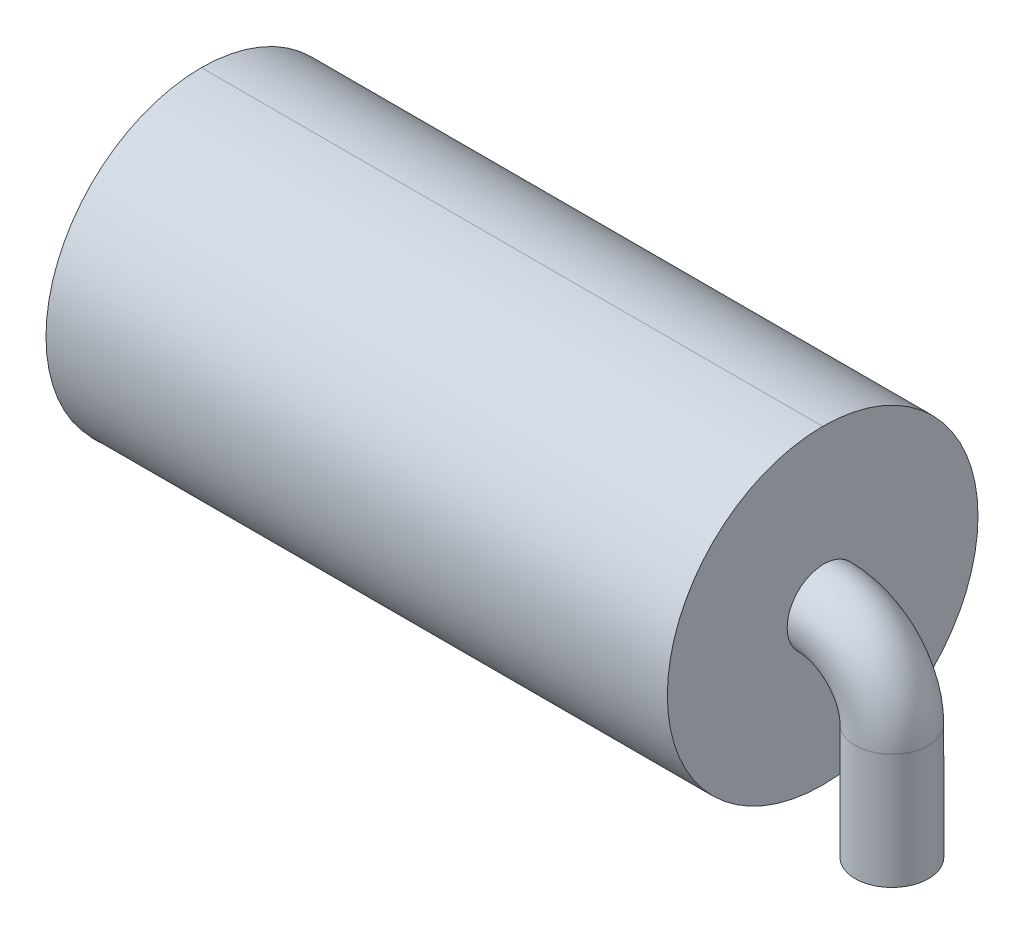
ISO-10303-21;
HEADER;
FILE_DESCRIPTION(('STEP AP214'),'2;1');
FILE_NAME('part.step','',(''),(''),'','','');
FILE_SCHEMA(('AUTOMOTIVE_DESIGN { 1 0 10303 214 1 1 1 1 }'));
ENDSEC;
DATA;
#1=APPLICATION_CONTEXT('core data for automotive mechanical design processes');
#2=APPLICATION_PROTOCOL_DEFINITION('international standard','automotive_design',2000,#1);
#3=PRODUCT_CONTEXT('',#1,'mechanical');
#4=PRODUCT('Part','Part','',(#3));
#5=PRODUCT_RELATED_PRODUCT_CATEGORY('part','',(#4));
#6=PRODUCT_DEFINITION_FORMATION('','',#4);
#7=PRODUCT_DEFINITION_CONTEXT('part definition',#1,'design');
#8=PRODUCT_DEFINITION('design','',#6,#7);
#9=PRODUCT_DEFINITION_SHAPE('','',#8);
#10=(LENGTH_UNIT() NAMED_UNIT(*) SI_UNIT(.MILLI.,.METRE.));
#11=(NAMED_UNIT(*) PLANE_ANGLE_UNIT() SI_UNIT($,.RADIAN.));
#12=(NAMED_UNIT(*) SI_UNIT($,.STERADIAN.) SOLID_ANGLE_UNIT());
#13=UNCERTAINTY_MEASURE_WITH_UNIT(LENGTH_MEASURE(1.E-05),#10,'distance_accuracy_value','');
#14=(GEOMETRIC_REPRESENTATION_CONTEXT(3) GLOBAL_UNCERTAINTY_ASSIGNED_CONTEXT((#13)) GLOBAL_UNIT_ASSIGNED_CONTEXT((#10,
#11,#12)) REPRESENTATION_CONTEXT('',''));
#15=CARTESIAN_POINT('',(0.,0.,0.));
#16=DIRECTION('',(0.,0.,1.));
#17=DIRECTION('',(1.,0.,0.));
#18=AXIS2_PLACEMENT_3D('',#15,#16,#17);
#19=CARTESIAN_POINT('',(2.54,0.,0.));
#20=DIRECTION('',(1.,0.,0.));
#21=DIRECTION('',(0.,1.,0.));
#22=AXIS2_PLACEMENT_3D('',#19,#20,#21);
#23=PLANE('',#22);
#24=CARTESIAN_POINT('',(2.55,0.299999999766548,-1.18351607946541E-05));
#25=CARTESIAN_POINT('',(2.55,0.300000297545742,0.00489690830954471));
#26=CARTESIAN_POINT('',(2.55,0.299879912208961,0.00980564768074171));
#27=CARTESIAN_POINT('',(2.55,0.299398522495433,0.0196113150831491));
#28=CARTESIAN_POINT('',(2.55,0.299037518118686,0.0245082431143594));
#29=CARTESIAN_POINT('',(2.55,0.29807563751721,0.0342784846950915));
#30=CARTESIAN_POINT('',(2.55,0.297474761292481,0.0391517982446132));
#31=CARTESIAN_POINT('',(2.55,0.296034617382054,0.0488630722339955));
#32=CARTESIAN_POINT('',(2.55,0.295195349696356,0.0537010326738559));
#33=CARTESIAN_POINT('',(2.55,0.293280435938311,0.0633299449417355));
#34=CARTESIAN_POINT('',(2.55,0.292204789865964,0.0681208967697547));
#35=CARTESIAN_POINT('',(2.55,0.28981971301685,0.0776442501070406));
#36=CARTESIAN_POINT('',(2.55,0.288510282240083,0.0823766516163074));
#37=CARTESIAN_POINT('',(2.55,0.285660789884107,0.0917715035153467));
#38=CARTESIAN_POINT('',(2.55,0.284120728304898,0.0964339539051193));
#39=CARTESIAN_POINT('',(2.55,0.280813684656474,0.105677671322104));
#40=CARTESIAN_POINT('',(2.55,0.279046702587259,0.110258938349317));
#41=CARTESIAN_POINT('',(2.55,0.275290074728061,0.119329252365416));
#42=CARTESIAN_POINT('',(2.55,0.273300428938078,0.123818299354303));
#43=CARTESIAN_POINT('',(2.55,0.269103266880471,0.132693358786957));
#44=CARTESIAN_POINT('',(2.55,0.266895750612848,0.137079371230725));
#45=CARTESIAN_POINT('',(2.55,0.26226816569675,0.145737795284833));
#46=CARTESIAN_POINT('',(2.55,0.259848097048276,0.150010206895175));
#47=CARTESIAN_POINT('',(2.55,0.254801237528696,0.158431136668687));
#48=CARTESIAN_POINT('',(2.55,0.25217444665759,0.162579654831857));
#49=CARTESIAN_POINT('',(2.55,0.246720470861802,0.170742803567392));
#50=CARTESIAN_POINT('',(2.55,0.243893285937119,0.174757434139757));
#51=CARTESIAN_POINT('',(2.55,0.238045332970355,0.182643136096996));
#52=CARTESIAN_POINT('',(2.55,0.235024564928274,0.18651420748187));
#53=CARTESIAN_POINT('',(2.55,0.228796723021497,0.194103465314094));
#54=CARTESIAN_POINT('',(2.55,0.225589649156801,0.197821651761444));
#55=CARTESIAN_POINT('',(2.55,0.218996921726648,0.205096182281794));
#56=CARTESIAN_POINT('',(2.55,0.215611268161191,0.208652526354794));
#57=CARTESIAN_POINT('',(2.55,0.208669537665495,0.215594804582075));
#58=CARTESIAN_POINT('',(2.55,0.205113460735257,0.218980738736356));
#59=CARTESIAN_POINT('',(2.55,0.19783945041082,0.22557404011424));
#60=CARTESIAN_POINT('',(2.55,0.194121517016622,0.228781407337844));
#61=CARTESIAN_POINT('',(2.55,0.186532750591388,0.235009848025827));
#62=CARTESIAN_POINT('',(2.55,0.182661917560353,0.238030921490207));
#63=CARTESIAN_POINT('',(2.55,0.174776677037546,0.243879496629052));
#64=CARTESIAN_POINT('',(2.55,0.170762269545774,0.246706998303518));
#65=CARTESIAN_POINT('',(2.55,0.162599551159704,0.252161618163712));
#66=CARTESIAN_POINT('',(2.55,0.158451240265405,0.25478873634944));
#67=CARTESIAN_POINT('',(2.55,0.150030708722526,0.259836260272961));
#68=CARTESIAN_POINT('',(2.55,0.145758488073946,0.262256666010754));
#69=CARTESIAN_POINT('',(2.55,0.1371004291615,0.26688493407413));
#70=CARTESIAN_POINT('',(2.55,0.132714590897634,0.269092796399714));
#71=CARTESIAN_POINT('',(2.55,0.123839862678189,0.273290658685718));
#72=CARTESIAN_POINT('',(2.55,0.11935097272261,0.275280658646137));
#73=CARTESIAN_POINT('',(2.55,0.110280499548081,0.279038190882758));
#74=CARTESIAN_POINT('',(2.55,0.105698907064323,0.280805700794276));
#75=CARTESIAN_POINT('',(2.55,0.0964545056700425,0.284113760474185));
#76=CARTESIAN_POINT('',(2.55,0.0917916967595192,0.285654310242576));
#77=CARTESIAN_POINT('',(2.55,0.0823960978310381,0.288504737596677));
#78=CARTESIAN_POINT('',(2.55,0.0776633078130804,0.289814615182389));
#79=CARTESIAN_POINT('',(2.55,0.0681391506793861,0.292200541920545));
#80=CARTESIAN_POINT('',(2.55,0.0633477835636495,0.29327659107299));
#81=CARTESIAN_POINT('',(2.55,0.0537180173747562,0.295192268129134));
#82=CARTESIAN_POINT('',(2.55,0.0488796183015995,0.296031896032834));
#83=CARTESIAN_POINT('',(2.55,0.0391674466592728,0.297472707447017));
#84=CARTESIAN_POINT('',(2.55,0.0342936740901026,0.298073890957501));
#85=CARTESIAN_POINT('',(2.55,0.0245224991904051,0.299036364992468));
#86=CARTESIAN_POINT('',(2.55,0.0196250968598776,0.299397655516952));
#87=CARTESIAN_POINT('',(2.55,0.00981846296242212,0.299879473017911));
#88=CARTESIAN_POINT('',(2.55,0.00490923139549403,0.299999999994387));
#89=CARTESIAN_POINT('',(2.55,-0.00490824533017328,0.300000000005612));
#90=CARTESIAN_POINT('',(2.55,-0.00981649048898137,0.299879521453451));
#91=CARTESIAN_POINT('',(2.55,-0.0196211588809042,0.299397897443319));
#92=CARTESIAN_POINT('',(2.55,-0.0245175821140188,0.299036751985348));
#93=CARTESIAN_POINT('',(2.55,-0.0342868129952257,0.298074664013237));
#94=CARTESIAN_POINT('',(2.55,-0.0391596206433179,0.297473721499096));
#95=CARTESIAN_POINT('',(2.55,-0.0488698837229764,0.296033486848894));
#96=CARTESIAN_POINT('',(2.55,-0.0537073391545428,0.295194194712833));
#97=CARTESIAN_POINT('',(2.55,-0.0633352462808615,0.293279282339953));
#98=CARTESIAN_POINT('',(2.55,-0.0681256979756137,0.292203662103136));
#99=CARTESIAN_POINT('',(2.55,-0.0776480593272049,0.289818684273547));
#100=CARTESIAN_POINT('',(2.55,-0.0823799689840438,0.288509326680775));
#101=CARTESIAN_POINT('',(2.55,-0.0917738489782767,0.285660027855973));
#102=CARTESIAN_POINT('',(2.55,-0.0964358193156706,0.284120086623943));
#103=CARTESIAN_POINT('',(2.55,-0.105678591779769,0.280813329654067));
#104=CARTESIAN_POINT('',(2.55,-0.110259393906474,0.279046513916221));
#105=CARTESIAN_POINT('',(2.55,-0.119329252318495,0.275290074741635));
#106=CARTESIAN_POINT('',(2.55,-0.123818299341731,0.273300428941715));
#107=CARTESIAN_POINT('',(2.55,-0.13269335879953,0.269103266876834));
#108=CARTESIAN_POINT('',(2.55,-0.137079371234093,0.266895750611873));
#109=CARTESIAN_POINT('',(2.55,-0.145737795281465,0.262268165697725));
#110=CARTESIAN_POINT('',(2.55,-0.150010206894272,0.259848097048537));
#111=CARTESIAN_POINT('',(2.55,-0.158431136669589,0.254801237528435));
#112=CARTESIAN_POINT('',(2.55,-0.162579654832099,0.25217444665752));
#113=CARTESIAN_POINT('',(2.55,-0.17074280356715,0.246720470861872));
#114=CARTESIAN_POINT('',(2.55,-0.174757434139692,0.243893285937138));
#115=CARTESIAN_POINT('',(2.55,-0.182643136097061,0.238045332970336));
#116=CARTESIAN_POINT('',(2.55,-0.186514207481887,0.235024564928269));
#117=CARTESIAN_POINT('',(2.55,-0.194103465314077,0.228796723021502));
#118=CARTESIAN_POINT('',(2.55,-0.197821651761439,0.225589649156803));
#119=CARTESIAN_POINT('',(2.55,-0.205096182281799,0.218996921726647));
#120=CARTESIAN_POINT('',(2.55,-0.208652526354796,0.21561126816119));
#121=CARTESIAN_POINT('',(2.55,-0.215594804582073,0.208669537665497));
#122=CARTESIAN_POINT('',(2.55,-0.218980738736353,0.205113460735261));
#123=CARTESIAN_POINT('',(2.55,-0.225574040114242,0.197839450410815));
#124=CARTESIAN_POINT('',(2.55,-0.228781407337851,0.194121517016604));
#125=CARTESIAN_POINT('',(2.55,-0.23500984802582,0.186532750591405));
#126=CARTESIAN_POINT('',(2.55,-0.23803092149018,0.182661917560417));
#127=CARTESIAN_POINT('',(2.55,-0.243879496629078,0.174776677037482));
#128=CARTESIAN_POINT('',(2.55,-0.246706998303616,0.170762269545534));
#129=CARTESIAN_POINT('',(2.55,-0.252161618163614,0.162599551159945));
#130=CARTESIAN_POINT('',(2.55,-0.254788736349073,0.158451240266303));
#131=CARTESIAN_POINT('',(2.55,-0.259836260273329,0.150030708721629));
#132=CARTESIAN_POINT('',(2.55,-0.262256666012126,0.145758488070596));
#133=CARTESIAN_POINT('',(2.55,-0.266884934072758,0.137100429164849));
#134=CARTESIAN_POINT('',(2.55,-0.269092796394593,0.132714590910134));
#135=CARTESIAN_POINT('',(2.55,-0.273290658690838,0.12383986266569));
#136=CARTESIAN_POINT('',(2.55,-0.275280658665247,0.119350972675962));
#137=CARTESIAN_POINT('',(2.55,-0.279038002170251,0.11028095509006));
#138=CARTESIAN_POINT('',(2.55,-0.280805345700845,0.105699827493887));
#139=CARTESIAN_POINT('',(2.55,-0.284113118678187,0.0964563710349634));
#140=CARTESIAN_POINT('',(2.55,-0.285653548124936,0.091794042172213));
#141=CARTESIAN_POINT('',(2.55,-0.288503781735927,0.0823994151304181));
#142=CARTESIAN_POINT('',(2.55,-0.28981358590017,0.0776671169513737));
#143=CARTESIAN_POINT('',(2.55,-0.292199414144647,0.068143951828851));
#144=CARTESIAN_POINT('',(2.55,-0.293275438224881,0.0633530848853727));
#145=CARTESIAN_POINT('',(2.55,-0.295191111708465,0.053724323736213));
#146=CARTESIAN_POINT('',(2.55,-0.296030761111815,0.0488864295305316));
#147=CARTESIAN_POINT('',(2.55,-0.297471671247686,0.0391752692002758));
#148=CARTESIAN_POINT('',(2.55,-0.298072931980207,0.0343020030757014));
#149=CARTESIAN_POINT('',(2.55,-0.299035583461222,0.0245318374187915));
#150=CARTESIAN_POINT('',(2.55,-0.299396974209716,0.0196349378864561));
#151=CARTESIAN_POINT('',(2.55,-0.299879137599415,0.00982930849673524));
#152=CARTESIAN_POINT('',(2.55,-0.299999910240619,0.00492057863934978));
#153=CARTESIAN_POINT('',(2.55,-0.299999999766548,1.18351607947575E-05));
#154=B_SPLINE_CURVE_WITH_KNOTS('',3,(#24,#25,#26,#27,#28,#29,#30,#31,#32,#33,#34,#35,#36,#37,
#38,#39,#40,#41,#42,#43,#44,#45,#46,#47,#48,#49,#50,#51,#52,#53,#54,#55,#56,#57,#58,#59,#60,#61,
#62,#63,#64,#65,#66,#67,#68,#69,#70,#71,#72,#73,#74,#75,#76,#77,#78,#79,#80,#81,#82,#83,#84,#85,
#86,#87,#88,#89,#90,#91,#92,#93,#94,#95,#96,#97,#98,#99,#100,#101,#102,#103,#104,#105,#106,#107,
#108,#109,#110,#111,#112,#113,#114,#115,#116,#117,#118,#119,#120,#121,#122,#123,#124,#125,#126,
#127,#128,#129,#130,#131,#132,#133,#134,#135,#136,#137,#138,#139,#140,#141,#142,#143,#144,#145,
#146,#147,#148,#149,#150,#151,#152,#153),.UNSPECIFIED.,.F.,.F.,(4,2,2,2,2,2,2,2,2,2,2,2,2,2,2,2,
2,2,2,2,2,2,2,2,2,2,2,2,2,2,2,2,2,2,2,2,2,2,2,2,2,2,2,2,2,2,2,2,2,2,2,2,2,2,2,2,2,2,2,2,2,2,2,2,
4),(0.,0.0147247371137475,0.0294494742274948,0.0441742113412422,0.0588989484549896,
0.0736236855687369,0.0883484226824843,0.103073159796232,0.117797896909979,0.132522634023726,
0.147247371137474,0.161972108251221,0.176696845364968,0.191421582478716,0.206146319592463,
0.220871056706211,0.235595793819958,0.250320530933705,0.265045268047453,0.2797700051612,
0.294494742274947,0.309219479388695,0.323944216502442,0.33866895361619,0.353393690729937,
0.368119906793173,0.382846122856409,0.397572338919645,0.412298554982882,0.427024771046118,
0.441750987109354,0.45647720317259,0.471203419235826,0.485926677399995,0.500649935564164,
0.515373193728334,0.530096451892503,0.544819710056671,0.55954296822084,0.574266226385009,
0.588989484549179,0.603714221662926,0.618438958776673,0.633163695890421,0.647888433004168,
0.662613170117916,0.677337907231663,0.69206264434541,0.706787381459158,0.721512118572905,
0.736236855686652,0.7509615928004,0.765686329914147,0.780411067027895,0.795135804141642,
0.809860541255389,0.824585278369137,0.839310015482884,0.854034752596631,0.868759489710379,
0.883484226824126,0.898208963937874,0.912933701051621,0.927658438165368,0.942383175279116),.UNSPECIFIED.);
#155=CARTESIAN_POINT('',(2.54999875,0.302400007287901,-5.91758068940519E-06));
#156=VERTEX_POINT('',#155);
#157=CARTESIAN_POINT('',(2.54999875,-0.3024000072879,5.91758068945396E-06));
#158=VERTEX_POINT('',#157);
#159=EDGE_CURVE('E96',#156,#158,#154,.T.);
#160=ORIENTED_EDGE('',*,*,#159,.F.);
#161=CARTESIAN_POINT('',(2.55,-0.299999999766548,1.1835160794684E-05));
#162=CARTESIAN_POINT('',(2.55,-0.300000297545742,-0.00489690830954473));
#163=CARTESIAN_POINT('',(2.55,-0.299879912208961,-0.00980564768074177));
#164=CARTESIAN_POINT('',(2.55,-0.299398522495433,-0.0196113150831491));
#165=CARTESIAN_POINT('',(2.55,-0.299037518118686,-0.0245082431143594));
#166=CARTESIAN_POINT('',(2.55,-0.29807563751721,-0.0342784846950915));
#167=CARTESIAN_POINT('',(2.55,-0.297474761292481,-0.0391517982446133));
#168=CARTESIAN_POINT('',(2.55,-0.296034617382054,-0.0488630722339955));
#169=CARTESIAN_POINT('',(2.55,-0.295195349696356,-0.0537010326738559));
#170=CARTESIAN_POINT('',(2.55,-0.293280435938311,-0.0633299449417356));
#171=CARTESIAN_POINT('',(2.55,-0.292204789865964,-0.0681208967697548));
#172=CARTESIAN_POINT('',(2.55,-0.28981971301685,-0.0776442501070407));
#173=CARTESIAN_POINT('',(2.55,-0.288510282240083,-0.0823766516163074));
#174=CARTESIAN_POINT('',(2.55,-0.285660789884107,-0.0917715035153467));
#175=CARTESIAN_POINT('',(2.55,-0.284120728304898,-0.0964339539051192));
#176=CARTESIAN_POINT('',(2.55,-0.280813684656474,-0.105677671322104));
#177=CARTESIAN_POINT('',(2.55,-0.279046702587259,-0.110258938349317));
#178=CARTESIAN_POINT('',(2.55,-0.275290074728061,-0.119329252365416));
#179=CARTESIAN_POINT('',(2.55,-0.273300428938078,-0.123818299354303));
#180=CARTESIAN_POINT('',(2.55,-0.269103266880471,-0.132693358786957));
#181=CARTESIAN_POINT('',(2.55,-0.266895750612848,-0.137079371230725));
#182=CARTESIAN_POINT('',(2.55,-0.26226816569675,-0.145737795284833));
#183=CARTESIAN_POINT('',(2.55,-0.259848097048276,-0.150010206895175));
#184=CARTESIAN_POINT('',(2.55,-0.254801237528696,-0.158431136668687));
#185=CARTESIAN_POINT('',(2.55,-0.25217444665759,-0.162579654831857));
#186=CARTESIAN_POINT('',(2.55,-0.246720470861802,-0.170742803567392));
#187=CARTESIAN_POINT('',(2.55,-0.243893285937119,-0.174757434139757));
#188=CARTESIAN_POINT('',(2.55,-0.238045332970355,-0.182643136096996));
#189=CARTESIAN_POINT('',(2.55,-0.235024564928274,-0.18651420748187));
#190=CARTESIAN_POINT('',(2.55,-0.228796723021497,-0.194103465314094));
#191=CARTESIAN_POINT('',(2.55,-0.225589649156802,-0.197821651761444));
#192=CARTESIAN_POINT('',(2.55,-0.218996921726648,-0.205096182281795));
#193=CARTESIAN_POINT('',(2.55,-0.21561126816119,-0.208652526354795));
#194=CARTESIAN_POINT('',(2.55,-0.208669537665496,-0.215594804582074));
#195=CARTESIAN_POINT('',(2.55,-0.205113460735261,-0.218980738736354));
#196=CARTESIAN_POINT('',(2.55,-0.197839450410815,-0.225574040114242));
#197=CARTESIAN_POINT('',(2.55,-0.194121517016604,-0.22878140733785));
#198=CARTESIAN_POINT('',(2.55,-0.186532750591405,-0.235009848025821));
#199=CARTESIAN_POINT('',(2.55,-0.182661917560417,-0.238030921490184));
#200=CARTESIAN_POINT('',(2.55,-0.174776677037481,-0.243879496629075));
#201=CARTESIAN_POINT('',(2.55,-0.170762269545533,-0.246706998303602));
#202=CARTESIAN_POINT('',(2.55,-0.162599551159945,-0.252161618163628));
#203=CARTESIAN_POINT('',(2.55,-0.158451240266305,-0.254788736349126));
#204=CARTESIAN_POINT('',(2.55,-0.150030708721626,-0.259836260273276));
#205=CARTESIAN_POINT('',(2.55,-0.145758488070587,-0.262256666011927));
#206=CARTESIAN_POINT('',(2.55,-0.137100429164859,-0.266884934072957));
#207=CARTESIAN_POINT('',(2.55,-0.13271459091017,-0.269092796395335));
#208=CARTESIAN_POINT('',(2.55,-0.123839862665654,-0.273290658690097));
#209=CARTESIAN_POINT('',(2.55,-0.119350972675826,-0.275280658662481));
#210=CARTESIAN_POINT('',(2.55,-0.110280955090196,-0.279038002173018));
#211=CARTESIAN_POINT('',(2.55,-0.105699827494395,-0.280805345711171));
#212=CARTESIAN_POINT('',(2.55,-0.0964563710344556,-0.284113118667861));
#213=CARTESIAN_POINT('',(2.55,-0.0917940421703181,-0.285653548086399));
#214=CARTESIAN_POINT('',(2.55,-0.0823994151323127,-0.288503781774464));
#215=CARTESIAN_POINT('',(2.55,-0.0776671169584448,-0.289813586043992));
#216=CARTESIAN_POINT('',(2.55,-0.0681439518217798,-0.292199414000825));
#217=CARTESIAN_POINT('',(2.55,-0.0633530848589827,-0.293275437688132));
#218=CARTESIAN_POINT('',(2.55,-0.053724323762603,-0.295191112245213));
#219=CARTESIAN_POINT('',(2.55,-0.0488864296290204,-0.296030763114987));
#220=CARTESIAN_POINT('',(2.55,-0.039175269101787,-0.297471669244514));
#221=CARTESIAN_POINT('',(2.55,-0.0343020027081362,-0.298072924504266));
#222=CARTESIAN_POINT('',(2.55,-0.0245318377863565,-0.299035590937164));
#223=CARTESIAN_POINT('',(2.55,-0.0196349392582276,-0.299397002110309));
#224=CARTESIAN_POINT('',(2.55,-0.00982930712496348,-0.299879109698822));
#225=CARTESIAN_POINT('',(2.55,-0.0049205735198283,-0.299999806114189));
#226=CARTESIAN_POINT('',(2.55,0.00489690319823924,-0.300000193418908));
#227=CARTESIAN_POINT('',(2.55,0.00980564631117161,-0.29987988430826));
#228=CARTESIAN_POINT('',(2.55,0.0196113164527193,-0.299398550396134));
#229=CARTESIAN_POINT('',(2.55,0.0245082434813346,-0.299037525594656));
#230=CARTESIAN_POINT('',(2.55,0.0342784843281162,-0.29807563004124));
#231=CARTESIAN_POINT('',(2.55,0.0391517981462825,-0.297474759289301));
#232=CARTESIAN_POINT('',(2.55,0.0488630723323262,-0.296034619385235));
#233=CARTESIAN_POINT('',(2.55,0.0537010327002036,-0.295195350233107));
#234=CARTESIAN_POINT('',(2.55,0.0633299449153879,-0.29328043540156));
#235=CARTESIAN_POINT('',(2.55,0.0681208967626949,-0.292204789722142));
#236=CARTESIAN_POINT('',(2.55,0.0776442501141005,-0.289819713160672));
#237=CARTESIAN_POINT('',(2.55,0.0823766516181991,-0.28851028227862));
#238=CARTESIAN_POINT('',(2.55,0.091771503513455,-0.28566078984557));
#239=CARTESIAN_POINT('',(2.55,0.0964339539046124,-0.284120728294572));
#240=CARTESIAN_POINT('',(2.55,0.105677671322611,-0.2808136846668));
#241=CARTESIAN_POINT('',(2.55,0.110258938349453,-0.279046702590026));
#242=CARTESIAN_POINT('',(2.55,0.119329252365281,-0.275290074725294));
#243=CARTESIAN_POINT('',(2.55,0.123818299354267,-0.273300428937336));
#244=CARTESIAN_POINT('',(2.55,0.132693358786994,-0.269103266881212));
#245=CARTESIAN_POINT('',(2.55,0.137079371230735,-0.266895750613046));
#246=CARTESIAN_POINT('',(2.55,0.145737795284824,-0.262268165696551));
#247=CARTESIAN_POINT('',(2.55,0.150010206895172,-0.259848097048222));
#248=CARTESIAN_POINT('',(2.55,0.158431136668689,-0.254801237528749));
#249=CARTESIAN_POINT('',(2.55,0.162579654831857,-0.252174446657604));
#250=CARTESIAN_POINT('',(2.55,0.170742803567391,-0.246720470861788));
#251=CARTESIAN_POINT('',(2.55,0.174757434139757,-0.243893285937115));
#252=CARTESIAN_POINT('',(2.55,0.182643136096996,-0.238045332970359));
#253=CARTESIAN_POINT('',(2.55,0.18651420748187,-0.235024564928275));
#254=CARTESIAN_POINT('',(2.55,0.194103465314094,-0.228796723021496));
#255=CARTESIAN_POINT('',(2.55,0.197821651761444,-0.225589649156802));
#256=CARTESIAN_POINT('',(2.55,0.205096182281795,-0.218996921726648));
#257=CARTESIAN_POINT('',(2.55,0.208652526354795,-0.21561126816119));
#258=CARTESIAN_POINT('',(2.55,0.215594804582074,-0.208669537665496));
#259=CARTESIAN_POINT('',(2.55,0.218980738736354,-0.205113460735261));
#260=CARTESIAN_POINT('',(2.55,0.225574040114242,-0.197839450410815));
#261=CARTESIAN_POINT('',(2.55,0.228781407337851,-0.194121517016604));
#262=CARTESIAN_POINT('',(2.55,0.23500984802582,-0.186532750591405));
#263=CARTESIAN_POINT('',(2.55,0.23803092149018,-0.182661917560417));
#264=CARTESIAN_POINT('',(2.55,0.243879496629078,-0.174776677037482));
#265=CARTESIAN_POINT('',(2.55,0.246706998303616,-0.170762269545534));
#266=CARTESIAN_POINT('',(2.55,0.252161618163614,-0.162599551159945));
#267=CARTESIAN_POINT('',(2.55,0.254788736349073,-0.158451240266303));
#268=CARTESIAN_POINT('',(2.55,0.259836260273329,-0.150030708721629));
#269=CARTESIAN_POINT('',(2.55,0.262256666012126,-0.145758488070596));
#270=CARTESIAN_POINT('',(2.55,0.266884934072758,-0.137100429164849));
#271=CARTESIAN_POINT('',(2.55,0.269092796394593,-0.132714590910134));
#272=CARTESIAN_POINT('',(2.55,0.273290658690838,-0.12383986266569));
#273=CARTESIAN_POINT('',(2.55,0.275280658665247,-0.119350972675962));
#274=CARTESIAN_POINT('',(2.55,0.279038002170251,-0.11028095509006));
#275=CARTESIAN_POINT('',(2.55,0.280805345700845,-0.105699827493887));
#276=CARTESIAN_POINT('',(2.55,0.284113118678187,-0.0964563710349633));
#277=CARTESIAN_POINT('',(2.55,0.285653548124936,-0.0917940421722128));
#278=CARTESIAN_POINT('',(2.55,0.288503781735927,-0.082399415130418));
#279=CARTESIAN_POINT('',(2.55,0.28981358590017,-0.0776671169513737));
#280=CARTESIAN_POINT('',(2.55,0.292199414144647,-0.068143951828851));
#281=CARTESIAN_POINT('',(2.55,0.29327543822488,-0.0633530848853727));
#282=CARTESIAN_POINT('',(2.55,0.295191111708464,-0.053724323736213));
#283=CARTESIAN_POINT('',(2.55,0.296030761111815,-0.0488864295305316));
#284=CARTESIAN_POINT('',(2.55,0.297471671247686,-0.0391752692002758));
#285=CARTESIAN_POINT('',(2.55,0.298072931980208,-0.0343020030757013));
#286=CARTESIAN_POINT('',(2.55,0.299035583461223,-0.0245318374187915));
#287=CARTESIAN_POINT('',(2.55,0.299396974209716,-0.019634937886456));
#288=CARTESIAN_POINT('',(2.55,0.299879137599415,-0.00982930849673514));
#289=CARTESIAN_POINT('',(2.55,0.299999910240619,-0.00492057863934968));
#290=CARTESIAN_POINT('',(2.55,0.299999999766548,-1.18351607946541E-05));
#291=B_SPLINE_CURVE_WITH_KNOTS('',3,(#161,#162,#163,#164,#165,#166,#167,#168,#169,#170,#171,
#172,#173,#174,#175,#176,#177,#178,#179,#180,#181,#182,#183,#184,#185,#186,#187,#188,#189,#190,
#191,#192,#193,#194,#195,#196,#197,#198,#199,#200,#201,#202,#203,#204,#205,#206,#207,#208,#209,
#210,#211,#212,#213,#214,#215,#216,#217,#218,#219,#220,#221,#222,#223,#224,#225,#226,#227,#228,
#229,#230,#231,#232,#233,#234,#235,#236,#237,#238,#239,#240,#241,#242,#243,#244,#245,#246,#247,
#248,#249,#250,#251,#252,#253,#254,#255,#256,#257,#258,#259,#260,#261,#262,#263,#264,#265,#266,
#267,#268,#269,#270,#271,#272,#273,#274,#275,#276,#277,#278,#279,#280,#281,#282,#283,#284,#285,
#286,#287,#288,#289,#290),.UNSPECIFIED.,.F.,.F.,(4,2,2,2,2,2,2,2,2,2,2,2,2,2,2,2,2,2,2,2,2,2,2,
2,2,2,2,2,2,2,2,2,2,2,2,2,2,2,2,2,2,2,2,2,2,2,2,2,2,2,2,2,2,2,2,2,2,2,2,2,2,2,2,2,4),(0.,
0.0147247371137476,0.0294494742274949,0.0441742113412422,0.0588989484549895,0.073623685568737,
0.0883484226824843,0.103073159796232,0.117797896909979,0.132522634023726,0.147247371137474,
0.161972108251221,0.176696845364969,0.191421582478716,0.206146319592463,0.220871056706211,
0.235595793819958,0.250320530933705,0.265045268047453,0.2797700051612,0.294494742274947,
0.309219479388695,0.323944216502442,0.33866895361619,0.353393690729937,0.368118427843684,
0.382843164957432,0.397567902071179,0.412292639184926,0.427017376298674,0.441742113412421,
0.456466850526169,0.471191587639916,0.485916324753663,0.500641061867411,0.515365798981158,
0.530090536094906,0.544815273208653,0.5595400103224,0.574264747436148,0.588989484549895,
0.603714221663642,0.61843895877739,0.633163695891137,0.647888433004884,0.662613170118632,
0.677337907232379,0.692062644346127,0.706787381459874,0.721512118573621,0.736236855687369,
0.750961592801116,0.765686329914864,0.780411067028611,0.795135804142358,0.809860541256106,
0.824585278369853,0.8393100154836,0.854034752597348,0.868759489711095,0.883484226824842,
0.89820896393859,0.912933701052337,0.927658438166085,0.942383175279832),.UNSPECIFIED.);
#292=EDGE_CURVE('E12',#158,#156,#291,.T.);
#293=ORIENTED_EDGE('',*,*,#292,.F.);
#294=EDGE_LOOP('',(#160,#293));
#295=FACE_BOUND('',#294,.T.);
#296=CARTESIAN_POINT('',(2.54,0.,0.));
#297=DIRECTION('',(1.,0.,0.));
#298=DIRECTION('',(0.,1.,0.));
#299=AXIS2_PLACEMENT_3D('',#296,#297,#298);
#300=CIRCLE('',#299,1.27);
#301=CARTESIAN_POINT('',(2.54,1.27,0.));
#302=VERTEX_POINT('',#301);
#303=CARTESIAN_POINT('',(2.54,-1.27,0.));
#304=VERTEX_POINT('',#303);
#305=EDGE_CURVE('E106',#302,#304,#300,.T.);
#306=ORIENTED_EDGE('',*,*,#305,.T.);
#307=CARTESIAN_POINT('',(2.54,0.,0.));
#308=DIRECTION('',(1.,0.,0.));
#309=DIRECTION('',(0.,-1.,0.));
#310=AXIS2_PLACEMENT_3D('',#307,#308,#309);
#311=CIRCLE('',#310,1.27);
#312=EDGE_CURVE('E148',#304,#302,#311,.T.);
#313=ORIENTED_EDGE('',*,*,#312,.T.);
#314=EDGE_LOOP('',(#306,#313));
#315=FACE_BOUND('',#314,.T.);
#316=ADVANCED_FACE('F75',(#295,#315),#23,.T.);
#317=CARTESIAN_POINT('',(-2.54,0.,0.));
#318=DIRECTION('',(1.,0.,0.));
#319=DIRECTION('',(0.,-1.,0.));
#320=AXIS2_PLACEMENT_3D('',#317,#318,#319);
#321=CYLINDRICAL_SURFACE('',#320,1.27);
#322=DIRECTION('',(1.,0.,0.));
#323=VECTOR('',#322,1.);
#324=CARTESIAN_POINT('',(-2.54,-1.27,0.));
#325=LINE('',#324,#323);
#326=CARTESIAN_POINT('',(-2.54,-1.27,0.));
#327=VERTEX_POINT('',#326);
#328=EDGE_CURVE('E142',#327,#304,#325,.T.);
#329=ORIENTED_EDGE('',*,*,#328,.T.);
#330=ORIENTED_EDGE('',*,*,#305,.F.);
#331=DIRECTION('',(1.,0.,0.));
#332=VECTOR('',#331,1.);
#333=CARTESIAN_POINT('',(-2.54,1.27,0.));
#334=LINE('',#333,#332);
#335=CARTESIAN_POINT('',(-2.54,1.27,0.));
#336=VERTEX_POINT('',#335);
#337=EDGE_CURVE('E157',#336,#302,#334,.T.);
#338=ORIENTED_EDGE('',*,*,#337,.F.);
#339=CARTESIAN_POINT('',(-2.54,0.,0.));
#340=DIRECTION('',(1.,0.,0.));
#341=DIRECTION('',(0.,1.,0.));
#342=AXIS2_PLACEMENT_3D('',#339,#340,#341);
#343=CIRCLE('',#342,1.27);
#344=EDGE_CURVE('E155',#336,#327,#343,.T.);
#345=ORIENTED_EDGE('',*,*,#344,.T.);
#346=EDGE_LOOP('',(#329,#330,#338,#345));
#347=FACE_BOUND('',#346,.T.);
#348=ADVANCED_FACE('F159',(#347),#321,.T.);
#349=CARTESIAN_POINT('',(-2.54,0.,0.));
#350=DIRECTION('',(1.,0.,0.));
#351=DIRECTION('',(0.,-1.,0.));
#352=AXIS2_PLACEMENT_3D('',#349,#350,#351);
#353=CYLINDRICAL_SURFACE('',#352,1.27);
#354=ORIENTED_EDGE('',*,*,#337,.T.);
#355=ORIENTED_EDGE('',*,*,#312,.F.);
#356=ORIENTED_EDGE('',*,*,#328,.F.);
#357=CARTESIAN_POINT('',(-2.54,0.,0.));
#358=DIRECTION('',(1.,0.,0.));
#359=DIRECTION('',(0.,-1.,0.));
#360=AXIS2_PLACEMENT_3D('',#357,#358,#359);
#361=CIRCLE('',#360,1.27);
#362=EDGE_CURVE('E146',#327,#336,#361,.T.);
#363=ORIENTED_EDGE('',*,*,#362,.T.);
#364=EDGE_LOOP('',(#354,#355,#356,#363));
#365=FACE_BOUND('',#364,.T.);
#366=ADVANCED_FACE('F145',(#365),#353,.T.);
#367=CARTESIAN_POINT('',(-2.54,0.,0.));
#368=DIRECTION('',(1.,0.,0.));
#369=DIRECTION('',(0.,1.,0.));
#370=AXIS2_PLACEMENT_3D('',#367,#368,#369);
#371=PLANE('',#370);
#372=CARTESIAN_POINT('',(-2.54,0.3048,0.));
#373=CARTESIAN_POINT('',(-2.54,0.3048,0.125811869372665));
#374=CARTESIAN_POINT('',(-2.54,0.21552614690566,0.21552614690566));
#375=CARTESIAN_POINT('',(-2.54,0.127001526365803,0.304487495613473));
#376=CARTESIAN_POINT('',(-2.54,0.,0.3048));
#377=CARTESIAN_POINT('',(-2.54,-0.125501532420495,0.305108813449094));
#378=CARTESIAN_POINT('',(-2.54,-0.21552614690566,0.21552614690566));
#379=CARTESIAN_POINT('',(-2.54,-0.3048,0.126690556122699));
#380=CARTESIAN_POINT('',(-2.54,-0.3048,0.));
#381=B_SPLINE_CURVE_WITH_KNOTS('',2,(#372,#373,#374,#375,#376,#377,#378,#379,#380),
.UNSPECIFIED.,.F.,.F.,(3,2,2,2,3),(0.,0.25,0.5,0.75,1.),.UNSPECIFIED.);
#382=CARTESIAN_POINT('',(-2.54999875,0.3024000072879,5.91758068943138E-06));
#383=VERTEX_POINT('',#382);
#384=CARTESIAN_POINT('',(-2.54999875,-0.3024000072879,-5.9175806893326E-06));
#385=VERTEX_POINT('',#384);
#386=EDGE_CURVE('E132',#383,#385,#381,.T.);
#387=ORIENTED_EDGE('',*,*,#386,.T.);
#388=CARTESIAN_POINT('',(-2.54,-0.3048,0.));
#389=CARTESIAN_POINT('',(-2.54,-0.3048,-0.125811869372665));
#390=CARTESIAN_POINT('',(-2.54,-0.21552614690566,-0.21552614690566));
#391=CARTESIAN_POINT('',(-2.54,-0.127001526365803,-0.304487495613473));
#392=CARTESIAN_POINT('',(-2.54,0.,-0.3048));
#393=CARTESIAN_POINT('',(-2.54,0.125501532420495,-0.305108813449094));
#394=CARTESIAN_POINT('',(-2.54,0.21552614690566,-0.21552614690566));
#395=CARTESIAN_POINT('',(-2.54,0.3048,-0.126690556122699));
#396=CARTESIAN_POINT('',(-2.54,0.3048,0.));
#397=B_SPLINE_CURVE_WITH_KNOTS('',2,(#388,#389,#390,#391,#392,#393,#394,#395,#396),
.UNSPECIFIED.,.F.,.F.,(3,2,2,2,3),(0.,0.25,0.5,0.75,1.),.UNSPECIFIED.);
#398=EDGE_CURVE('E86',#385,#383,#397,.T.);
#399=ORIENTED_EDGE('',*,*,#398,.T.);
#400=EDGE_LOOP('',(#387,#399));
#401=FACE_BOUND('',#400,.T.);
#402=ORIENTED_EDGE('',*,*,#344,.F.);
#403=ORIENTED_EDGE('',*,*,#362,.F.);
#404=EDGE_LOOP('',(#402,#403));
#405=FACE_BOUND('',#404,.T.);
#406=ADVANCED_FACE('F154',(#401,#405),#371,.F.);
#407=CARTESIAN_POINT('',(-3.106,-1.5,0.));
#408=DIRECTION('',(0.,1.,0.));
#409=DIRECTION('',(0.,0.,1.));
#410=AXIS2_PLACEMENT_3D('',#407,#408,#409);
#411=PLANE('',#410);
#412=CARTESIAN_POINT('',(-3.106,-1.5,0.));
#413=DIRECTION('',(0.,1.,0.));
#414=DIRECTION('',(0.,0.,1.));
#415=AXIS2_PLACEMENT_3D('',#412,#413,#414);
#416=CIRCLE('',#415,0.3);
#417=CARTESIAN_POINT('',(-3.106,-1.5,0.3));
#418=VERTEX_POINT('',#417);
#419=EDGE_CURVE('E218',#418,#418,#416,.T.);
#420=ORIENTED_EDGE('',*,*,#419,.F.);
#421=EDGE_LOOP('',(#420));
#422=FACE_BOUND('',#421,.T.);
#423=ADVANCED_FACE('F187',(#422),#411,.F.);
#424=CARTESIAN_POINT('',(-2.55,-0.556,0.));
#425=DIRECTION('',(0.,0.,1.));
#426=DIRECTION('',(1.,0.,0.));
#427=AXIS2_PLACEMENT_3D('',#424,#425,#426);
#428=TOROIDAL_SURFACE('',#427,0.556,0.3);
#429=CARTESIAN_POINT('',(-3.106,-0.556,0.));
#430=DIRECTION('',(0.,1.,0.));
#431=DIRECTION('',(0.,0.,1.));
#432=AXIS2_PLACEMENT_3D('',#429,#430,#431);
#433=CIRCLE('',#432,0.3);
#434=CARTESIAN_POINT('',(-3.106,-0.556,0.3));
#435=VERTEX_POINT('',#434);
#436=EDGE_CURVE('E215',#435,#435,#433,.T.);
#437=ORIENTED_EDGE('',*,*,#436,.T.);
#438=EDGE_LOOP('',(#437));
#439=FACE_BOUND('',#438,.T.);
#440=ORIENTED_EDGE('',*,*,#398,.F.);
#441=ORIENTED_EDGE('',*,*,#386,.F.);
#442=EDGE_LOOP('',(#440,#441));
#443=FACE_BOUND('',#442,.T.);
#444=ADVANCED_FACE('F225',(#439,#443),#428,.T.);
#445=CARTESIAN_POINT('',(-3.106,-0.556,0.));
#446=DIRECTION('',(0.,-1.,0.));
#447=DIRECTION('',(0.,0.,-1.));
#448=AXIS2_PLACEMENT_3D('',#445,#446,#447);
#449=CYLINDRICAL_SURFACE('',#448,0.3);
#450=ORIENTED_EDGE('',*,*,#419,.T.);
#451=EDGE_LOOP('',(#450));
#452=FACE_BOUND('',#451,.T.);
#453=ORIENTED_EDGE('',*,*,#436,.F.);
#454=EDGE_LOOP('',(#453));
#455=FACE_BOUND('',#454,.T.);
#456=ADVANCED_FACE('F188',(#452,#455),#449,.T.);
#457=CARTESIAN_POINT('',(3.106,-1.5,0.));
#458=DIRECTION('',(0.,1.,0.));
#459=DIRECTION('',(0.,0.,1.));
#460=AXIS2_PLACEMENT_3D('',#457,#458,#459);
#461=PLANE('',#460);
#462=CARTESIAN_POINT('',(3.106,-1.5,0.));
#463=DIRECTION('',(0.,-1.,0.));
#464=DIRECTION('',(0.,0.,1.));
#465=AXIS2_PLACEMENT_3D('',#462,#463,#464);
#466=CIRCLE('',#465,0.3);
#467=CARTESIAN_POINT('',(3.106,-1.5,0.3));
#468=VERTEX_POINT('',#467);
#469=EDGE_CURVE('E219',#468,#468,#466,.F.);
#470=ORIENTED_EDGE('',*,*,#469,.F.);
#471=EDGE_LOOP('',(#470));
#472=FACE_BOUND('',#471,.T.);
#473=ADVANCED_FACE('F235',(#472),#461,.F.);
#474=CARTESIAN_POINT('',(2.55,-0.556,0.));
#475=DIRECTION('',(0.,0.,-1.));
#476=DIRECTION('',(-1.,0.,0.));
#477=AXIS2_PLACEMENT_3D('',#474,#475,#476);
#478=TOROIDAL_SURFACE('',#477,0.556,0.3);
#479=CARTESIAN_POINT('',(3.106,-0.556,0.));
#480=DIRECTION('',(0.,-1.,0.));
#481=DIRECTION('',(0.,0.,1.));
#482=AXIS2_PLACEMENT_3D('',#479,#480,#481);
#483=CIRCLE('',#482,0.3);
#484=CARTESIAN_POINT('',(3.106,-0.556,0.3));
#485=VERTEX_POINT('',#484);
#486=EDGE_CURVE('E313',#485,#485,#483,.F.);
#487=ORIENTED_EDGE('',*,*,#486,.T.);
#488=EDGE_LOOP('',(#487));
#489=FACE_BOUND('',#488,.T.);
#490=ORIENTED_EDGE('',*,*,#292,.T.);
#491=ORIENTED_EDGE('',*,*,#159,.T.);
#492=EDGE_LOOP('',(#490,#491));
#493=FACE_BOUND('',#492,.T.);
#494=ADVANCED_FACE('F209',(#489,#493),#478,.T.);
#495=CARTESIAN_POINT('',(3.106,-0.556,0.));
#496=DIRECTION('',(0.,-1.,0.));
#497=DIRECTION('',(0.,0.,-1.));
#498=AXIS2_PLACEMENT_3D('',#495,#496,#497);
#499=CYLINDRICAL_SURFACE('',#498,0.3);
#500=ORIENTED_EDGE('',*,*,#469,.T.);
#501=EDGE_LOOP('',(#500));
#502=FACE_BOUND('',#501,.T.);
#503=ORIENTED_EDGE('',*,*,#486,.F.);
#504=EDGE_LOOP('',(#503));
#505=FACE_BOUND('',#504,.T.);
#506=ADVANCED_FACE('F271',(#502,#505),#499,.T.);
#507=CLOSED_SHELL('',(#316,#348,#366,#406,#423,#444,#456,#473,#494,#506));
#508=MANIFOLD_SOLID_BREP('B2',#507);
#509=ADVANCED_BREP_SHAPE_REPRESENTATION('',(#18,#508),#14);
#510=SHAPE_DEFINITION_REPRESENTATION(#9,#509);
ENDSEC;
END-ISO-10303-21;
